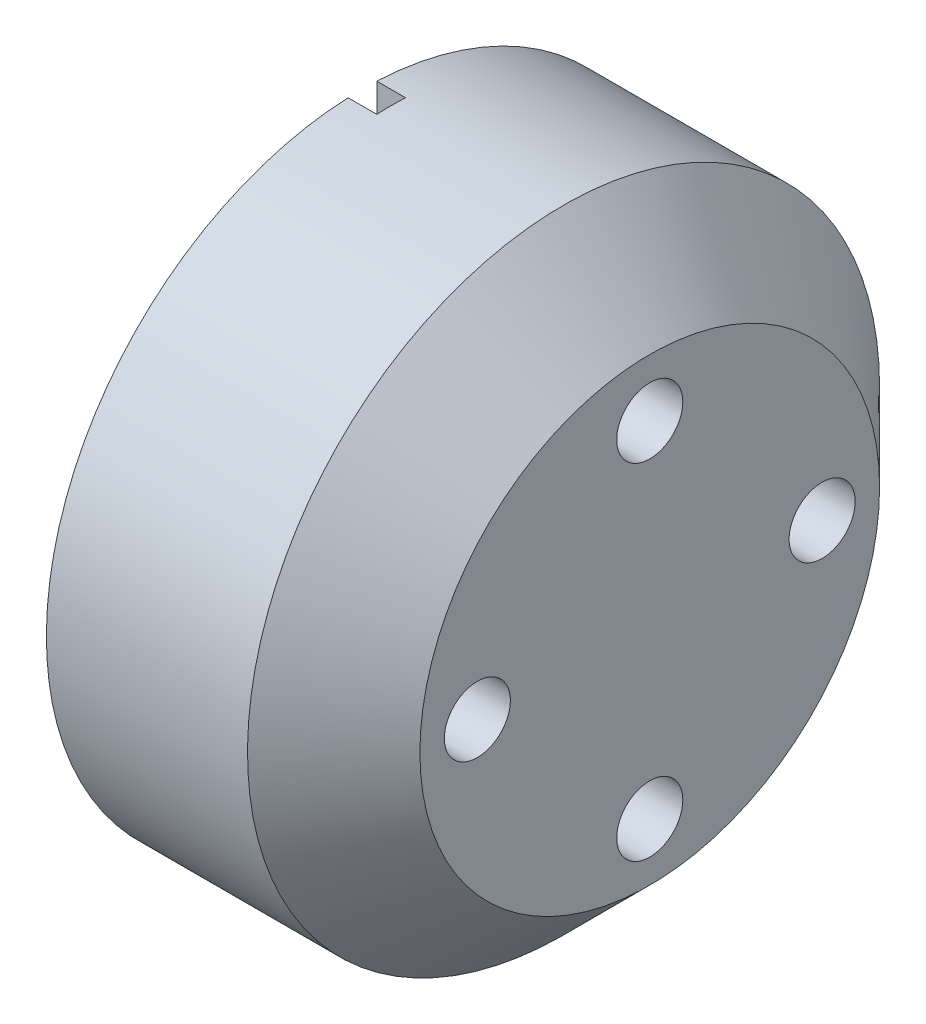
ISO-10303-21;
HEADER;
FILE_DESCRIPTION(('STEP AP214'),'2;1');
FILE_NAME('part.step','',(''),(''),'','','');
FILE_SCHEMA(('AUTOMOTIVE_DESIGN { 1 0 10303 214 1 1 1 1 }'));
ENDSEC;
DATA;
#1=APPLICATION_CONTEXT('core data for automotive mechanical design processes');
#2=APPLICATION_PROTOCOL_DEFINITION('international standard','automotive_design',2000,#1);
#3=PRODUCT_CONTEXT('',#1,'mechanical');
#4=PRODUCT('Part','Part','',(#3));
#5=PRODUCT_RELATED_PRODUCT_CATEGORY('part','',(#4));
#6=PRODUCT_DEFINITION_FORMATION('','',#4);
#7=PRODUCT_DEFINITION_CONTEXT('part definition',#1,'design');
#8=PRODUCT_DEFINITION('design','',#6,#7);
#9=PRODUCT_DEFINITION_SHAPE('','',#8);
#10=(LENGTH_UNIT() NAMED_UNIT(*) SI_UNIT(.MILLI.,.METRE.));
#11=(NAMED_UNIT(*) PLANE_ANGLE_UNIT() SI_UNIT($,.RADIAN.));
#12=(NAMED_UNIT(*) SI_UNIT($,.STERADIAN.) SOLID_ANGLE_UNIT());
#13=UNCERTAINTY_MEASURE_WITH_UNIT(LENGTH_MEASURE(1.E-05),#10,'distance_accuracy_value','');
#14=(GEOMETRIC_REPRESENTATION_CONTEXT(3) GLOBAL_UNCERTAINTY_ASSIGNED_CONTEXT((#13)) GLOBAL_UNIT_ASSIGNED_CONTEXT((#10,
#11,#12)) REPRESENTATION_CONTEXT('',''));
#15=CARTESIAN_POINT('',(0.,0.,0.));
#16=DIRECTION('',(0.,0.,1.));
#17=DIRECTION('',(1.,0.,0.));
#18=AXIS2_PLACEMENT_3D('',#15,#16,#17);
#19=CARTESIAN_POINT('',(10.,0.,0.));
#20=DIRECTION('',(1.,0.,0.));
#21=DIRECTION('',(0.,0.,-1.));
#22=AXIS2_PLACEMENT_3D('',#19,#20,#21);
#23=PLANE('',#22);
#24=CARTESIAN_POINT('',(10.,0.,0.));
#25=DIRECTION('',(1.,0.,0.));
#26=DIRECTION('',(0.,0.,-1.));
#27=AXIS2_PLACEMENT_3D('',#24,#25,#26);
#28=CIRCLE('',#27,7.99999999999998);
#29=CARTESIAN_POINT('',(10.,0.,-7.99999999999998));
#30=VERTEX_POINT('',#29);
#31=EDGE_CURVE('E156',#30,#30,#28,.T.);
#32=ORIENTED_EDGE('',*,*,#31,.T.);
#33=EDGE_LOOP('',(#32));
#34=FACE_BOUND('',#33,.T.);
#35=CARTESIAN_POINT('',(10.,-6.,0.));
#36=DIRECTION('',(1.,0.,0.));
#37=DIRECTION('',(0.,0.,-1.));
#38=AXIS2_PLACEMENT_3D('',#35,#36,#37);
#39=CIRCLE('',#38,1.15);
#40=CARTESIAN_POINT('',(10.,-6.,-1.15));
#41=VERTEX_POINT('',#40);
#42=EDGE_CURVE('E143',#41,#41,#39,.T.);
#43=ORIENTED_EDGE('',*,*,#42,.F.);
#44=EDGE_LOOP('',(#43));
#45=FACE_BOUND('',#44,.T.);
#46=CARTESIAN_POINT('',(10.,6.,0.));
#47=DIRECTION('',(1.,0.,0.));
#48=DIRECTION('',(0.,0.,-1.));
#49=AXIS2_PLACEMENT_3D('',#46,#47,#48);
#50=CIRCLE('',#49,1.15);
#51=CARTESIAN_POINT('',(10.,6.,-1.15));
#52=VERTEX_POINT('',#51);
#53=EDGE_CURVE('E150',#52,#52,#50,.T.);
#54=ORIENTED_EDGE('',*,*,#53,.F.);
#55=EDGE_LOOP('',(#54));
#56=FACE_BOUND('',#55,.T.);
#57=CARTESIAN_POINT('',(10.,0.,6.));
#58=DIRECTION('',(1.,0.,0.));
#59=DIRECTION('',(0.,0.,-1.));
#60=AXIS2_PLACEMENT_3D('',#57,#58,#59);
#61=CIRCLE('',#60,1.15);
#62=CARTESIAN_POINT('',(10.,0.,4.85));
#63=VERTEX_POINT('',#62);
#64=EDGE_CURVE('E147',#63,#63,#61,.T.);
#65=ORIENTED_EDGE('',*,*,#64,.F.);
#66=EDGE_LOOP('',(#65));
#67=FACE_BOUND('',#66,.T.);
#68=CARTESIAN_POINT('',(10.,0.,-6.));
#69=DIRECTION('',(1.,0.,0.));
#70=DIRECTION('',(0.,0.,-1.));
#71=AXIS2_PLACEMENT_3D('',#68,#69,#70);
#72=CIRCLE('',#71,1.15);
#73=CARTESIAN_POINT('',(10.,0.,-7.15));
#74=VERTEX_POINT('',#73);
#75=EDGE_CURVE('E140',#74,#74,#72,.T.);
#76=ORIENTED_EDGE('',*,*,#75,.F.);
#77=EDGE_LOOP('',(#76));
#78=FACE_BOUND('',#77,.T.);
#79=ADVANCED_FACE('F36',(#34,#45,#56,#67,#78),#23,.T.);
#80=CARTESIAN_POINT('',(0.,0.,0.));
#81=DIRECTION('',(1.,0.,0.));
#82=DIRECTION('',(0.,0.,-1.));
#83=AXIS2_PLACEMENT_3D('',#80,#81,#82);
#84=PLANE('',#83);
#85=CARTESIAN_POINT('',(0.,-5.30330085889914,-5.30330085889908));
#86=DIRECTION('',(1.,0.,0.));
#87=DIRECTION('',(0.,0.,-1.));
#88=AXIS2_PLACEMENT_3D('',#85,#86,#87);
#89=CIRCLE('',#88,2.29999999999999);
#90=CARTESIAN_POINT('',(0.,-5.30330085889914,-7.60330085889906));
#91=VERTEX_POINT('',#90);
#92=EDGE_CURVE('E184',#91,#91,#89,.T.);
#93=ORIENTED_EDGE('',*,*,#92,.T.);
#94=EDGE_LOOP('',(#93));
#95=FACE_BOUND('',#94,.T.);
#96=CARTESIAN_POINT('',(0.,-5.30330085889908,5.30330085889914));
#97=DIRECTION('',(1.,0.,0.));
#98=DIRECTION('',(0.,0.,-1.));
#99=AXIS2_PLACEMENT_3D('',#96,#97,#98);
#100=CIRCLE('',#99,2.29999999999999);
#101=CARTESIAN_POINT('',(0.,-5.30330085889908,3.00330085889915));
#102=VERTEX_POINT('',#101);
#103=EDGE_CURVE('E181',#102,#102,#100,.T.);
#104=ORIENTED_EDGE('',*,*,#103,.T.);
#105=EDGE_LOOP('',(#104));
#106=FACE_BOUND('',#105,.T.);
#107=CARTESIAN_POINT('',(0.,5.30330085889914,5.30330085889908));
#108=DIRECTION('',(1.,0.,0.));
#109=DIRECTION('',(0.,0.,-1.));
#110=AXIS2_PLACEMENT_3D('',#107,#108,#109);
#111=CIRCLE('',#110,2.29999999999999);
#112=CARTESIAN_POINT('',(0.,5.30330085889914,3.00330085889909));
#113=VERTEX_POINT('',#112);
#114=EDGE_CURVE('E178',#113,#113,#111,.T.);
#115=ORIENTED_EDGE('',*,*,#114,.T.);
#116=EDGE_LOOP('',(#115));
#117=FACE_BOUND('',#116,.T.);
#118=CARTESIAN_POINT('',(0.,5.30330085889908,-5.30330085889914));
#119=DIRECTION('',(1.,0.,0.));
#120=DIRECTION('',(0.,0.,-1.));
#121=AXIS2_PLACEMENT_3D('',#118,#119,#120);
#122=CIRCLE('',#121,2.30000000000001);
#123=CARTESIAN_POINT('',(0.,5.30330085889908,-7.60330085889915));
#124=VERTEX_POINT('',#123);
#125=EDGE_CURVE('E175',#124,#124,#122,.T.);
#126=ORIENTED_EDGE('',*,*,#125,.T.);
#127=EDGE_LOOP('',(#126));
#128=FACE_BOUND('',#127,.T.);
#129=CARTESIAN_POINT('',(0.,0.,-6.));
#130=DIRECTION('',(-1.,0.,0.));
#131=DIRECTION('',(0.,0.,1.));
#132=AXIS2_PLACEMENT_3D('',#129,#130,#131);
#133=CIRCLE('',#132,2.);
#134=CARTESIAN_POINT('',(0.,0.,-4.));
#135=VERTEX_POINT('',#134);
#136=EDGE_CURVE('E116',#135,#135,#133,.T.);
#137=ORIENTED_EDGE('',*,*,#136,.F.);
#138=EDGE_LOOP('',(#137));
#139=FACE_BOUND('',#138,.T.);
#140=CARTESIAN_POINT('',(0.,6.,0.));
#141=DIRECTION('',(-1.,0.,0.));
#142=DIRECTION('',(0.,0.,1.));
#143=AXIS2_PLACEMENT_3D('',#140,#141,#142);
#144=CIRCLE('',#143,2.);
#145=CARTESIAN_POINT('',(0.,6.,2.));
#146=VERTEX_POINT('',#145);
#147=EDGE_CURVE('E124',#146,#146,#144,.T.);
#148=ORIENTED_EDGE('',*,*,#147,.F.);
#149=EDGE_LOOP('',(#148));
#150=FACE_BOUND('',#149,.T.);
#151=CARTESIAN_POINT('',(0.,-6.,0.));
#152=DIRECTION('',(-1.,0.,0.));
#153=DIRECTION('',(0.,0.,1.));
#154=AXIS2_PLACEMENT_3D('',#151,#152,#153);
#155=CIRCLE('',#154,2.);
#156=CARTESIAN_POINT('',(0.,-6.,2.));
#157=VERTEX_POINT('',#156);
#158=EDGE_CURVE('E130',#157,#157,#155,.T.);
#159=ORIENTED_EDGE('',*,*,#158,.F.);
#160=EDGE_LOOP('',(#159));
#161=FACE_BOUND('',#160,.T.);
#162=CARTESIAN_POINT('',(0.,0.,6.));
#163=DIRECTION('',(-1.,0.,0.));
#164=DIRECTION('',(0.,0.,1.));
#165=AXIS2_PLACEMENT_3D('',#162,#163,#164);
#166=CIRCLE('',#165,2.);
#167=CARTESIAN_POINT('',(0.,0.,8.));
#168=VERTEX_POINT('',#167);
#169=EDGE_CURVE('E115',#168,#168,#166,.T.);
#170=ORIENTED_EDGE('',*,*,#169,.F.);
#171=EDGE_LOOP('',(#170));
#172=FACE_BOUND('',#171,.T.);
#173=CARTESIAN_POINT('',(0.,0.,0.));
#174=DIRECTION('',(1.,0.,0.));
#175=DIRECTION('',(0.,0.,-1.));
#176=AXIS2_PLACEMENT_3D('',#173,#174,#175);
#177=CIRCLE('',#176,11.);
#178=CARTESIAN_POINT('',(0.,10.988630487918,0.499999999999998));
#179=VERTEX_POINT('',#178);
#180=CARTESIAN_POINT('',(0.,10.988630487918,-0.500000000000001));
#181=VERTEX_POINT('',#180);
#182=EDGE_CURVE('E153',#179,#181,#177,.T.);
#183=ORIENTED_EDGE('',*,*,#182,.F.);
#184=DIRECTION('',(0.,1.,0.));
#185=VECTOR('',#184,1.);
#186=CARTESIAN_POINT('',(0.,9.5,0.499999999999999));
#187=LINE('',#186,#185);
#188=CARTESIAN_POINT('',(0.,9.5,0.499999999999999));
#189=VERTEX_POINT('',#188);
#190=EDGE_CURVE('E97',#189,#179,#187,.T.);
#191=ORIENTED_EDGE('',*,*,#190,.F.);
#192=DIRECTION('',(0.,0.,1.));
#193=VECTOR('',#192,1.);
#194=CARTESIAN_POINT('',(0.,9.5,-0.500000000000002));
#195=LINE('',#194,#193);
#196=CARTESIAN_POINT('',(0.,9.5,-0.500000000000002));
#197=VERTEX_POINT('',#196);
#198=EDGE_CURVE('E100',#197,#189,#195,.T.);
#199=ORIENTED_EDGE('',*,*,#198,.F.);
#200=DIRECTION('',(0.,-1.,0.));
#201=VECTOR('',#200,1.);
#202=CARTESIAN_POINT('',(0.,9.5,-0.500000000000002));
#203=LINE('',#202,#201);
#204=EDGE_CURVE('E87',#181,#197,#203,.T.);
#205=ORIENTED_EDGE('',*,*,#204,.F.);
#206=EDGE_LOOP('',(#183,#191,#199,#205));
#207=FACE_BOUND('',#206,.T.);
#208=ADVANCED_FACE('F200',(#95,#106,#117,#128,#139,#150,#161,#172,#207),#84,.F.);
#209=CARTESIAN_POINT('',(10.,0.,0.));
#210=DIRECTION('',(-1.,0.,0.));
#211=DIRECTION('',(0.,0.,1.));
#212=AXIS2_PLACEMENT_3D('',#209,#210,#211);
#213=CYLINDRICAL_SURFACE('',#212,11.);
#214=CARTESIAN_POINT('',(6.99999999999998,0.,0.));
#215=DIRECTION('',(1.,0.,0.));
#216=DIRECTION('',(0.,0.,-1.));
#217=AXIS2_PLACEMENT_3D('',#214,#215,#216);
#218=CIRCLE('',#217,11.);
#219=CARTESIAN_POINT('',(6.99999999999998,0.,-11.));
#220=VERTEX_POINT('',#219);
#221=EDGE_CURVE('E159',#220,#220,#218,.F.);
#222=ORIENTED_EDGE('',*,*,#221,.T.);
#223=EDGE_LOOP('',(#222));
#224=FACE_BOUND('',#223,.T.);
#225=CARTESIAN_POINT('',(0.999999999999999,0.,0.));
#226=DIRECTION('',(1.,0.,0.));
#227=DIRECTION('',(0.,0.,-1.));
#228=AXIS2_PLACEMENT_3D('',#225,#226,#227);
#229=CIRCLE('',#228,11.);
#230=CARTESIAN_POINT('',(0.999999999999999,10.988630487918,-0.500000000000001));
#231=VERTEX_POINT('',#230);
#232=CARTESIAN_POINT('',(0.999999999999999,10.988630487918,0.499999999999998));
#233=VERTEX_POINT('',#232);
#234=EDGE_CURVE('E57',#231,#233,#229,.T.);
#235=ORIENTED_EDGE('',*,*,#234,.T.);
#236=DIRECTION('',(-1.,0.,0.));
#237=VECTOR('',#236,1.);
#238=CARTESIAN_POINT('',(10.,10.988630487918,0.499999999999999));
#239=LINE('',#238,#237);
#240=EDGE_CURVE('E12',#233,#179,#239,.T.);
#241=ORIENTED_EDGE('',*,*,#240,.T.);
#242=ORIENTED_EDGE('',*,*,#182,.T.);
#243=DIRECTION('',(-1.,0.,0.));
#244=VECTOR('',#243,1.);
#245=CARTESIAN_POINT('',(10.,10.988630487918,-0.500000000000002));
#246=LINE('',#245,#244);
#247=EDGE_CURVE('E45',#181,#231,#246,.F.);
#248=ORIENTED_EDGE('',*,*,#247,.T.);
#249=EDGE_LOOP('',(#235,#241,#242,#248));
#250=FACE_BOUND('',#249,.T.);
#251=ADVANCED_FACE('F197',(#224,#250),#213,.T.);
#252=CARTESIAN_POINT('',(10.,6.,0.));
#253=DIRECTION('',(-1.,0.,0.));
#254=DIRECTION('',(0.,0.,1.));
#255=AXIS2_PLACEMENT_3D('',#252,#253,#254);
#256=CYLINDRICAL_SURFACE('',#255,1.15);
#257=CARTESIAN_POINT('',(4.5,6.,0.));
#258=DIRECTION('',(1.,0.,0.));
#259=DIRECTION('',(0.,0.,-1.));
#260=AXIS2_PLACEMENT_3D('',#257,#258,#259);
#261=CIRCLE('',#260,1.15);
#262=CARTESIAN_POINT('',(4.5,6.,-1.15));
#263=VERTEX_POINT('',#262);
#264=EDGE_CURVE('E144',#263,#263,#261,.T.);
#265=ORIENTED_EDGE('',*,*,#264,.F.);
#266=EDGE_LOOP('',(#265));
#267=FACE_BOUND('',#266,.T.);
#268=ORIENTED_EDGE('',*,*,#53,.T.);
#269=EDGE_LOOP('',(#268));
#270=FACE_BOUND('',#269,.T.);
#271=ADVANCED_FACE('F224',(#267,#270),#256,.F.);
#272=CARTESIAN_POINT('',(10.,0.,6.));
#273=DIRECTION('',(-1.,0.,0.));
#274=DIRECTION('',(0.,0.,1.));
#275=AXIS2_PLACEMENT_3D('',#272,#273,#274);
#276=CYLINDRICAL_SURFACE('',#275,1.15);
#277=CARTESIAN_POINT('',(4.5,0.,6.));
#278=DIRECTION('',(1.,0.,0.));
#279=DIRECTION('',(0.,0.,-1.));
#280=AXIS2_PLACEMENT_3D('',#277,#278,#279);
#281=CIRCLE('',#280,1.15);
#282=CARTESIAN_POINT('',(4.5,0.,4.85));
#283=VERTEX_POINT('',#282);
#284=EDGE_CURVE('E168',#283,#283,#281,.T.);
#285=ORIENTED_EDGE('',*,*,#284,.F.);
#286=EDGE_LOOP('',(#285));
#287=FACE_BOUND('',#286,.T.);
#288=ORIENTED_EDGE('',*,*,#64,.T.);
#289=EDGE_LOOP('',(#288));
#290=FACE_BOUND('',#289,.T.);
#291=ADVANCED_FACE('F320',(#287,#290),#276,.F.);
#292=CARTESIAN_POINT('',(10.,-6.,0.));
#293=DIRECTION('',(-1.,0.,0.));
#294=DIRECTION('',(0.,0.,1.));
#295=AXIS2_PLACEMENT_3D('',#292,#293,#294);
#296=CYLINDRICAL_SURFACE('',#295,1.15);
#297=CARTESIAN_POINT('',(4.5,-6.,0.));
#298=DIRECTION('',(1.,0.,0.));
#299=DIRECTION('',(0.,0.,-1.));
#300=AXIS2_PLACEMENT_3D('',#297,#298,#299);
#301=CIRCLE('',#300,1.15);
#302=CARTESIAN_POINT('',(4.5,-6.,-1.15));
#303=VERTEX_POINT('',#302);
#304=EDGE_CURVE('E165',#303,#303,#301,.T.);
#305=ORIENTED_EDGE('',*,*,#304,.F.);
#306=EDGE_LOOP('',(#305));
#307=FACE_BOUND('',#306,.T.);
#308=ORIENTED_EDGE('',*,*,#42,.T.);
#309=EDGE_LOOP('',(#308));
#310=FACE_BOUND('',#309,.T.);
#311=ADVANCED_FACE('F317',(#307,#310),#296,.F.);
#312=CARTESIAN_POINT('',(10.,0.,-6.));
#313=DIRECTION('',(-1.,0.,0.));
#314=DIRECTION('',(0.,0.,1.));
#315=AXIS2_PLACEMENT_3D('',#312,#313,#314);
#316=CYLINDRICAL_SURFACE('',#315,1.15);
#317=CARTESIAN_POINT('',(4.5,0.,-6.));
#318=DIRECTION('',(1.,0.,0.));
#319=DIRECTION('',(0.,0.,-1.));
#320=AXIS2_PLACEMENT_3D('',#317,#318,#319);
#321=CIRCLE('',#320,1.15);
#322=CARTESIAN_POINT('',(4.5,0.,-7.15));
#323=VERTEX_POINT('',#322);
#324=EDGE_CURVE('E123',#323,#323,#321,.T.);
#325=ORIENTED_EDGE('',*,*,#324,.F.);
#326=EDGE_LOOP('',(#325));
#327=FACE_BOUND('',#326,.T.);
#328=ORIENTED_EDGE('',*,*,#75,.T.);
#329=EDGE_LOOP('',(#328));
#330=FACE_BOUND('',#329,.T.);
#331=ADVANCED_FACE('F238',(#327,#330),#316,.F.);
#332=CARTESIAN_POINT('',(10.,0.,0.));
#333=DIRECTION('',(-1.,0.,0.));
#334=DIRECTION('',(0.,0.,1.));
#335=AXIS2_PLACEMENT_3D('',#332,#333,#334);
#336=CONICAL_SURFACE('',#335,7.99999999999998,0.785398163397449);
#337=ORIENTED_EDGE('',*,*,#221,.F.);
#338=EDGE_LOOP('',(#337));
#339=FACE_BOUND('',#338,.T.);
#340=ORIENTED_EDGE('',*,*,#31,.F.);
#341=EDGE_LOOP('',(#340));
#342=FACE_BOUND('',#341,.T.);
#343=ADVANCED_FACE('F231',(#339,#342),#336,.T.);
#344=CARTESIAN_POINT('',(4.5,0.,0.));
#345=DIRECTION('',(1.,0.,0.));
#346=DIRECTION('',(0.,0.,-1.));
#347=AXIS2_PLACEMENT_3D('',#344,#345,#346);
#348=PLANE('',#347);
#349=ORIENTED_EDGE('',*,*,#324,.T.);
#350=EDGE_LOOP('',(#349));
#351=FACE_BOUND('',#350,.T.);
#352=CARTESIAN_POINT('',(4.5,0.,-6.));
#353=DIRECTION('',(1.,0.,0.));
#354=DIRECTION('',(0.,0.,-1.));
#355=AXIS2_PLACEMENT_3D('',#352,#353,#354);
#356=CIRCLE('',#355,2.);
#357=CARTESIAN_POINT('',(4.5,0.,-8.));
#358=VERTEX_POINT('',#357);
#359=EDGE_CURVE('E119',#358,#358,#356,.F.);
#360=ORIENTED_EDGE('',*,*,#359,.T.);
#361=EDGE_LOOP('',(#360));
#362=FACE_BOUND('',#361,.T.);
#363=ADVANCED_FACE('F237',(#351,#362),#348,.F.);
#364=CARTESIAN_POINT('',(15.6568542494924,0.,-6.));
#365=DIRECTION('',(-1.,0.,0.));
#366=DIRECTION('',(0.,0.,1.));
#367=AXIS2_PLACEMENT_3D('',#364,#365,#366);
#368=CYLINDRICAL_SURFACE('',#367,2.);
#369=ORIENTED_EDGE('',*,*,#136,.T.);
#370=EDGE_LOOP('',(#369));
#371=FACE_BOUND('',#370,.T.);
#372=ORIENTED_EDGE('',*,*,#359,.F.);
#373=EDGE_LOOP('',(#372));
#374=FACE_BOUND('',#373,.T.);
#375=ADVANCED_FACE('F285',(#371,#374),#368,.F.);
#376=CARTESIAN_POINT('',(4.5,0.,0.));
#377=DIRECTION('',(1.,0.,0.));
#378=DIRECTION('',(0.,0.,-1.));
#379=AXIS2_PLACEMENT_3D('',#376,#377,#378);
#380=PLANE('',#379);
#381=ORIENTED_EDGE('',*,*,#304,.T.);
#382=EDGE_LOOP('',(#381));
#383=FACE_BOUND('',#382,.T.);
#384=CARTESIAN_POINT('',(4.5,-6.,0.));
#385=DIRECTION('',(1.,0.,0.));
#386=DIRECTION('',(0.,0.,-1.));
#387=AXIS2_PLACEMENT_3D('',#384,#385,#386);
#388=CIRCLE('',#387,2.);
#389=CARTESIAN_POINT('',(4.5,-6.,-2.));
#390=VERTEX_POINT('',#389);
#391=EDGE_CURVE('E127',#390,#390,#388,.F.);
#392=ORIENTED_EDGE('',*,*,#391,.T.);
#393=EDGE_LOOP('',(#392));
#394=FACE_BOUND('',#393,.T.);
#395=ADVANCED_FACE('F288',(#383,#394),#380,.F.);
#396=CARTESIAN_POINT('',(15.6568542494924,-6.,0.));
#397=DIRECTION('',(-1.,0.,0.));
#398=DIRECTION('',(0.,0.,1.));
#399=AXIS2_PLACEMENT_3D('',#396,#397,#398);
#400=CYLINDRICAL_SURFACE('',#399,2.);
#401=ORIENTED_EDGE('',*,*,#158,.T.);
#402=EDGE_LOOP('',(#401));
#403=FACE_BOUND('',#402,.T.);
#404=ORIENTED_EDGE('',*,*,#391,.F.);
#405=EDGE_LOOP('',(#404));
#406=FACE_BOUND('',#405,.T.);
#407=ADVANCED_FACE('F301',(#403,#406),#400,.F.);
#408=CARTESIAN_POINT('',(4.5,0.,0.));
#409=DIRECTION('',(1.,0.,0.));
#410=DIRECTION('',(0.,0.,-1.));
#411=AXIS2_PLACEMENT_3D('',#408,#409,#410);
#412=PLANE('',#411);
#413=ORIENTED_EDGE('',*,*,#284,.T.);
#414=EDGE_LOOP('',(#413));
#415=FACE_BOUND('',#414,.T.);
#416=CARTESIAN_POINT('',(4.5,0.,6.));
#417=DIRECTION('',(1.,0.,0.));
#418=DIRECTION('',(0.,0.,-1.));
#419=AXIS2_PLACEMENT_3D('',#416,#417,#418);
#420=CIRCLE('',#419,2.);
#421=CARTESIAN_POINT('',(4.5,0.,4.));
#422=VERTEX_POINT('',#421);
#423=EDGE_CURVE('E133',#422,#422,#420,.F.);
#424=ORIENTED_EDGE('',*,*,#423,.T.);
#425=EDGE_LOOP('',(#424));
#426=FACE_BOUND('',#425,.T.);
#427=ADVANCED_FACE('F304',(#415,#426),#412,.F.);
#428=CARTESIAN_POINT('',(15.6568542494924,0.,6.));
#429=DIRECTION('',(-1.,0.,0.));
#430=DIRECTION('',(0.,0.,1.));
#431=AXIS2_PLACEMENT_3D('',#428,#429,#430);
#432=CYLINDRICAL_SURFACE('',#431,2.);
#433=ORIENTED_EDGE('',*,*,#169,.T.);
#434=EDGE_LOOP('',(#433));
#435=FACE_BOUND('',#434,.T.);
#436=ORIENTED_EDGE('',*,*,#423,.F.);
#437=EDGE_LOOP('',(#436));
#438=FACE_BOUND('',#437,.T.);
#439=ADVANCED_FACE('F299',(#435,#438),#432,.F.);
#440=CARTESIAN_POINT('',(4.5,0.,0.));
#441=DIRECTION('',(1.,0.,0.));
#442=DIRECTION('',(0.,0.,-1.));
#443=AXIS2_PLACEMENT_3D('',#440,#441,#442);
#444=PLANE('',#443);
#445=ORIENTED_EDGE('',*,*,#264,.T.);
#446=EDGE_LOOP('',(#445));
#447=FACE_BOUND('',#446,.T.);
#448=CARTESIAN_POINT('',(4.5,6.,0.));
#449=DIRECTION('',(1.,0.,0.));
#450=DIRECTION('',(0.,0.,-1.));
#451=AXIS2_PLACEMENT_3D('',#448,#449,#450);
#452=CIRCLE('',#451,2.);
#453=CARTESIAN_POINT('',(4.5,6.,-2.));
#454=VERTEX_POINT('',#453);
#455=EDGE_CURVE('E120',#454,#454,#452,.F.);
#456=ORIENTED_EDGE('',*,*,#455,.T.);
#457=EDGE_LOOP('',(#456));
#458=FACE_BOUND('',#457,.T.);
#459=ADVANCED_FACE('F295',(#447,#458),#444,.F.);
#460=CARTESIAN_POINT('',(15.6568542494924,6.,0.));
#461=DIRECTION('',(-1.,0.,0.));
#462=DIRECTION('',(0.,0.,1.));
#463=AXIS2_PLACEMENT_3D('',#460,#461,#462);
#464=CYLINDRICAL_SURFACE('',#463,2.);
#465=ORIENTED_EDGE('',*,*,#147,.T.);
#466=EDGE_LOOP('',(#465));
#467=FACE_BOUND('',#466,.T.);
#468=ORIENTED_EDGE('',*,*,#455,.F.);
#469=EDGE_LOOP('',(#468));
#470=FACE_BOUND('',#469,.T.);
#471=ADVANCED_FACE('F268',(#467,#470),#464,.F.);
#472=CARTESIAN_POINT('',(8.,5.30330085889914,5.30330085889908));
#473=DIRECTION('',(-1.,0.,0.));
#474=DIRECTION('',(0.,0.,1.));
#475=AXIS2_PLACEMENT_3D('',#472,#473,#474);
#476=CYLINDRICAL_SURFACE('',#475,2.);
#477=CARTESIAN_POINT('',(1.19999999999996,5.30330085889914,5.30330085889908));
#478=DIRECTION('',(1.,0.,0.));
#479=DIRECTION('',(0.,0.,-1.));
#480=AXIS2_PLACEMENT_3D('',#477,#478,#479);
#481=CIRCLE('',#480,2.);
#482=CARTESIAN_POINT('',(1.19999999999996,5.30330085889914,3.30330085889907));
#483=VERTEX_POINT('',#482);
#484=EDGE_CURVE('E190',#483,#483,#481,.F.);
#485=ORIENTED_EDGE('',*,*,#484,.T.);
#486=EDGE_LOOP('',(#485));
#487=FACE_BOUND('',#486,.T.);
#488=CARTESIAN_POINT('',(8.,5.30330085889914,5.30330085889908));
#489=DIRECTION('',(-1.,0.,0.));
#490=DIRECTION('',(0.,0.,1.));
#491=AXIS2_PLACEMENT_3D('',#488,#489,#490);
#492=CIRCLE('',#491,2.);
#493=CARTESIAN_POINT('',(8.,5.30330085889914,7.30330085889908));
#494=VERTEX_POINT('',#493);
#495=EDGE_CURVE('E107',#494,#494,#492,.T.);
#496=ORIENTED_EDGE('',*,*,#495,.F.);
#497=EDGE_LOOP('',(#496));
#498=FACE_BOUND('',#497,.T.);
#499=ADVANCED_FACE('F264',(#487,#498),#476,.F.);
#500=CARTESIAN_POINT('',(8.,5.30330085889914,5.30330085889908));
#501=DIRECTION('',(-1.,0.,0.));
#502=DIRECTION('',(0.,0.,1.));
#503=AXIS2_PLACEMENT_3D('',#500,#501,#502);
#504=PLANE('',#503);
#505=ORIENTED_EDGE('',*,*,#495,.T.);
#506=EDGE_LOOP('',(#505));
#507=FACE_BOUND('',#506,.T.);
#508=ADVANCED_FACE('F267',(#507),#504,.T.);
#509=CARTESIAN_POINT('',(8.,5.30330085889908,-5.30330085889914));
#510=DIRECTION('',(-1.,0.,0.));
#511=DIRECTION('',(0.,0.,1.));
#512=AXIS2_PLACEMENT_3D('',#509,#510,#511);
#513=CYLINDRICAL_SURFACE('',#512,2.);
#514=CARTESIAN_POINT('',(1.20000000000006,5.30330085889908,-5.30330085889914));
#515=DIRECTION('',(1.,0.,0.));
#516=DIRECTION('',(0.,0.,-1.));
#517=AXIS2_PLACEMENT_3D('',#514,#515,#516);
#518=CIRCLE('',#517,2.);
#519=CARTESIAN_POINT('',(1.20000000000006,5.30330085889908,-7.30330085889914));
#520=VERTEX_POINT('',#519);
#521=EDGE_CURVE('E193',#520,#520,#518,.F.);
#522=ORIENTED_EDGE('',*,*,#521,.T.);
#523=EDGE_LOOP('',(#522));
#524=FACE_BOUND('',#523,.T.);
#525=CARTESIAN_POINT('',(8.,5.30330085889908,-5.30330085889914));
#526=DIRECTION('',(-1.,0.,0.));
#527=DIRECTION('',(0.,0.,1.));
#528=AXIS2_PLACEMENT_3D('',#525,#526,#527);
#529=CIRCLE('',#528,2.);
#530=CARTESIAN_POINT('',(8.,5.30330085889908,-3.30330085889913));
#531=VERTEX_POINT('',#530);
#532=EDGE_CURVE('E104',#531,#531,#529,.T.);
#533=ORIENTED_EDGE('',*,*,#532,.F.);
#534=EDGE_LOOP('',(#533));
#535=FACE_BOUND('',#534,.T.);
#536=ADVANCED_FACE('F273',(#524,#535),#513,.F.);
#537=CARTESIAN_POINT('',(8.,5.30330085889908,-5.30330085889914));
#538=DIRECTION('',(-1.,0.,0.));
#539=DIRECTION('',(0.,0.,1.));
#540=AXIS2_PLACEMENT_3D('',#537,#538,#539);
#541=PLANE('',#540);
#542=ORIENTED_EDGE('',*,*,#532,.T.);
#543=EDGE_LOOP('',(#542));
#544=FACE_BOUND('',#543,.T.);
#545=ADVANCED_FACE('F278',(#544),#541,.T.);
#546=CARTESIAN_POINT('',(8.,-5.30330085889914,-5.30330085889908));
#547=DIRECTION('',(-1.,0.,0.));
#548=DIRECTION('',(0.,0.,1.));
#549=AXIS2_PLACEMENT_3D('',#546,#547,#548);
#550=CYLINDRICAL_SURFACE('',#549,2.);
#551=CARTESIAN_POINT('',(1.19999999999997,-5.30330085889914,-5.30330085889908));
#552=DIRECTION('',(1.,0.,0.));
#553=DIRECTION('',(0.,0.,-1.));
#554=AXIS2_PLACEMENT_3D('',#551,#552,#553);
#555=CIRCLE('',#554,2.);
#556=CARTESIAN_POINT('',(1.19999999999997,-5.30330085889914,-7.30330085889907));
#557=VERTEX_POINT('',#556);
#558=EDGE_CURVE('E162',#557,#557,#555,.F.);
#559=ORIENTED_EDGE('',*,*,#558,.T.);
#560=EDGE_LOOP('',(#559));
#561=FACE_BOUND('',#560,.T.);
#562=CARTESIAN_POINT('',(8.,-5.30330085889914,-5.30330085889908));
#563=DIRECTION('',(-1.,0.,0.));
#564=DIRECTION('',(0.,0.,1.));
#565=AXIS2_PLACEMENT_3D('',#562,#563,#564);
#566=CIRCLE('',#565,2.);
#567=CARTESIAN_POINT('',(8.,-5.30330085889914,-3.30330085889908));
#568=VERTEX_POINT('',#567);
#569=EDGE_CURVE('E108',#568,#568,#566,.T.);
#570=ORIENTED_EDGE('',*,*,#569,.F.);
#571=EDGE_LOOP('',(#570));
#572=FACE_BOUND('',#571,.T.);
#573=ADVANCED_FACE('F398',(#561,#572),#550,.F.);
#574=CARTESIAN_POINT('',(8.,-5.30330085889914,-5.30330085889908));
#575=DIRECTION('',(-1.,0.,0.));
#576=DIRECTION('',(0.,0.,1.));
#577=AXIS2_PLACEMENT_3D('',#574,#575,#576);
#578=PLANE('',#577);
#579=ORIENTED_EDGE('',*,*,#569,.T.);
#580=EDGE_LOOP('',(#579));
#581=FACE_BOUND('',#580,.T.);
#582=ADVANCED_FACE('F391',(#581),#578,.T.);
#583=CARTESIAN_POINT('',(8.,-5.30330085889908,5.30330085889914));
#584=DIRECTION('',(-1.,0.,0.));
#585=DIRECTION('',(0.,0.,1.));
#586=AXIS2_PLACEMENT_3D('',#583,#584,#585);
#587=CYLINDRICAL_SURFACE('',#586,2.);
#588=CARTESIAN_POINT('',(1.19999999999997,-5.30330085889908,5.30330085889914));
#589=DIRECTION('',(1.,0.,0.));
#590=DIRECTION('',(0.,0.,-1.));
#591=AXIS2_PLACEMENT_3D('',#588,#589,#590);
#592=CIRCLE('',#591,2.);
#593=CARTESIAN_POINT('',(1.19999999999997,-5.30330085889908,3.30330085889914));
#594=VERTEX_POINT('',#593);
#595=EDGE_CURVE('E187',#594,#594,#592,.F.);
#596=ORIENTED_EDGE('',*,*,#595,.T.);
#597=EDGE_LOOP('',(#596));
#598=FACE_BOUND('',#597,.T.);
#599=CARTESIAN_POINT('',(8.,-5.30330085889908,5.30330085889914));
#600=DIRECTION('',(-1.,0.,0.));
#601=DIRECTION('',(0.,0.,1.));
#602=AXIS2_PLACEMENT_3D('',#599,#600,#601);
#603=CIRCLE('',#602,2.);
#604=CARTESIAN_POINT('',(8.,-5.30330085889908,7.30330085889914));
#605=VERTEX_POINT('',#604);
#606=EDGE_CURVE('E102',#605,#605,#603,.T.);
#607=ORIENTED_EDGE('',*,*,#606,.F.);
#608=EDGE_LOOP('',(#607));
#609=FACE_BOUND('',#608,.T.);
#610=ADVANCED_FACE('F282',(#598,#609),#587,.F.);
#611=CARTESIAN_POINT('',(8.,-5.30330085889908,5.30330085889914));
#612=DIRECTION('',(-1.,0.,0.));
#613=DIRECTION('',(0.,0.,1.));
#614=AXIS2_PLACEMENT_3D('',#611,#612,#613);
#615=PLANE('',#614);
#616=ORIENTED_EDGE('',*,*,#606,.T.);
#617=EDGE_LOOP('',(#616));
#618=FACE_BOUND('',#617,.T.);
#619=ADVANCED_FACE('F247',(#618),#615,.T.);
#620=CARTESIAN_POINT('',(1.19999999999997,-5.30330085889914,-5.30330085889908));
#621=DIRECTION('',(-1.,0.,0.));
#622=DIRECTION('',(0.,0.,1.));
#623=AXIS2_PLACEMENT_3D('',#620,#621,#622);
#624=CONICAL_SURFACE('',#623,2.,0.244978663126861);
#625=ORIENTED_EDGE('',*,*,#92,.F.);
#626=EDGE_LOOP('',(#625));
#627=FACE_BOUND('',#626,.T.);
#628=ORIENTED_EDGE('',*,*,#558,.F.);
#629=EDGE_LOOP('',(#628));
#630=FACE_BOUND('',#629,.T.);
#631=ADVANCED_FACE('F240',(#627,#630),#624,.F.);
#632=CARTESIAN_POINT('',(1.19999999999997,-5.30330085889908,5.30330085889914));
#633=DIRECTION('',(-1.,0.,0.));
#634=DIRECTION('',(0.,0.,1.));
#635=AXIS2_PLACEMENT_3D('',#632,#633,#634);
#636=CONICAL_SURFACE('',#635,2.,0.244978663126861);
#637=ORIENTED_EDGE('',*,*,#103,.F.);
#638=EDGE_LOOP('',(#637));
#639=FACE_BOUND('',#638,.T.);
#640=ORIENTED_EDGE('',*,*,#595,.F.);
#641=EDGE_LOOP('',(#640));
#642=FACE_BOUND('',#641,.T.);
#643=ADVANCED_FACE('F246',(#639,#642),#636,.F.);
#644=CARTESIAN_POINT('',(1.19999999999996,5.30330085889914,5.30330085889908));
#645=DIRECTION('',(-1.,0.,0.));
#646=DIRECTION('',(0.,0.,1.));
#647=AXIS2_PLACEMENT_3D('',#644,#645,#646);
#648=CONICAL_SURFACE('',#647,2.,0.244978663126861);
#649=ORIENTED_EDGE('',*,*,#114,.F.);
#650=EDGE_LOOP('',(#649));
#651=FACE_BOUND('',#650,.T.);
#652=ORIENTED_EDGE('',*,*,#484,.F.);
#653=EDGE_LOOP('',(#652));
#654=FACE_BOUND('',#653,.T.);
#655=ADVANCED_FACE('F211',(#651,#654),#648,.F.);
#656=CARTESIAN_POINT('',(1.20000000000006,5.30330085889908,-5.30330085889914));
#657=DIRECTION('',(-1.,0.,0.));
#658=DIRECTION('',(0.,0.,1.));
#659=AXIS2_PLACEMENT_3D('',#656,#657,#658);
#660=CONICAL_SURFACE('',#659,2.,0.24497866312686);
#661=ORIENTED_EDGE('',*,*,#125,.F.);
#662=EDGE_LOOP('',(#661));
#663=FACE_BOUND('',#662,.T.);
#664=ORIENTED_EDGE('',*,*,#521,.F.);
#665=EDGE_LOOP('',(#664));
#666=FACE_BOUND('',#665,.T.);
#667=ADVANCED_FACE('F39',(#663,#666),#660,.F.);
#668=CARTESIAN_POINT('',(1.,9.5,0.499999999999999));
#669=DIRECTION('',(0.,0.,1.));
#670=DIRECTION('',(1.,0.,0.));
#671=AXIS2_PLACEMENT_3D('',#668,#669,#670);
#672=PLANE('',#671);
#673=DIRECTION('',(0.,1.,0.));
#674=VECTOR('',#673,1.);
#675=CARTESIAN_POINT('',(1.,9.5,0.499999999999999));
#676=LINE('',#675,#674);
#677=CARTESIAN_POINT('',(1.,9.5,0.499999999999999));
#678=VERTEX_POINT('',#677);
#679=EDGE_CURVE('E52',#678,#233,#676,.T.);
#680=ORIENTED_EDGE('',*,*,#679,.F.);
#681=DIRECTION('',(-1.,0.,0.));
#682=VECTOR('',#681,1.);
#683=CARTESIAN_POINT('',(1.,9.5,0.499999999999999));
#684=LINE('',#683,#682);
#685=EDGE_CURVE('E91',#678,#189,#684,.T.);
#686=ORIENTED_EDGE('',*,*,#685,.T.);
#687=ORIENTED_EDGE('',*,*,#190,.T.);
#688=ORIENTED_EDGE('',*,*,#240,.F.);
#689=EDGE_LOOP('',(#680,#686,#687,#688));
#690=FACE_BOUND('',#689,.T.);
#691=ADVANCED_FACE('F203',(#690),#672,.F.);
#692=CARTESIAN_POINT('',(1.,9.5,-0.500000000000002));
#693=DIRECTION('',(0.,0.,-1.));
#694=DIRECTION('',(-1.,0.,0.));
#695=AXIS2_PLACEMENT_3D('',#692,#693,#694);
#696=PLANE('',#695);
#697=ORIENTED_EDGE('',*,*,#204,.T.);
#698=DIRECTION('',(-1.,0.,0.));
#699=VECTOR('',#698,1.);
#700=CARTESIAN_POINT('',(1.,9.5,-0.500000000000002));
#701=LINE('',#700,#699);
#702=CARTESIAN_POINT('',(1.,9.5,-0.500000000000002));
#703=VERTEX_POINT('',#702);
#704=EDGE_CURVE('E84',#703,#197,#701,.T.);
#705=ORIENTED_EDGE('',*,*,#704,.F.);
#706=DIRECTION('',(0.,-1.,0.));
#707=VECTOR('',#706,1.);
#708=CARTESIAN_POINT('',(1.,9.5,-0.500000000000002));
#709=LINE('',#708,#707);
#710=EDGE_CURVE('E75',#231,#703,#709,.T.);
#711=ORIENTED_EDGE('',*,*,#710,.F.);
#712=ORIENTED_EDGE('',*,*,#247,.F.);
#713=EDGE_LOOP('',(#697,#705,#711,#712));
#714=FACE_BOUND('',#713,.T.);
#715=ADVANCED_FACE('F85',(#714),#696,.F.);
#716=CARTESIAN_POINT('',(1.,0.,0.));
#717=DIRECTION('',(1.,0.,0.));
#718=DIRECTION('',(0.,0.,-1.));
#719=AXIS2_PLACEMENT_3D('',#716,#717,#718);
#720=PLANE('',#719);
#721=ORIENTED_EDGE('',*,*,#710,.T.);
#722=DIRECTION('',(0.,0.,1.));
#723=VECTOR('',#722,1.);
#724=CARTESIAN_POINT('',(1.,9.5,-0.500000000000002));
#725=LINE('',#724,#723);
#726=EDGE_CURVE('E79',#703,#678,#725,.T.);
#727=ORIENTED_EDGE('',*,*,#726,.T.);
#728=ORIENTED_EDGE('',*,*,#679,.T.);
#729=ORIENTED_EDGE('',*,*,#234,.F.);
#730=EDGE_LOOP('',(#721,#727,#728,#729));
#731=FACE_BOUND('',#730,.T.);
#732=ADVANCED_FACE('F77',(#731),#720,.F.);
#733=CARTESIAN_POINT('',(1.,9.5,-0.500000000000002));
#734=DIRECTION('',(0.,-1.,0.));
#735=DIRECTION('',(0.,0.,-1.));
#736=AXIS2_PLACEMENT_3D('',#733,#734,#735);
#737=PLANE('',#736);
#738=ORIENTED_EDGE('',*,*,#198,.T.);
#739=ORIENTED_EDGE('',*,*,#685,.F.);
#740=ORIENTED_EDGE('',*,*,#726,.F.);
#741=ORIENTED_EDGE('',*,*,#704,.T.);
#742=EDGE_LOOP('',(#738,#739,#740,#741));
#743=FACE_BOUND('',#742,.T.);
#744=ADVANCED_FACE('F93',(#743),#737,.F.);
#745=CLOSED_SHELL('',(#79,#208,#251,#271,#291,#311,#331,#343,#363,#375,#395,#407,#427,#439,#459,
#471,#499,#508,#536,#545,#573,#582,#610,#619,#631,#643,#655,#667,#691,#715,#732,#744));
#746=MANIFOLD_SOLID_BREP('B2',#745);
#747=ADVANCED_BREP_SHAPE_REPRESENTATION('',(#18,#746),#14);
#748=SHAPE_DEFINITION_REPRESENTATION(#9,#747);
ENDSEC;
END-ISO-10303-21;
